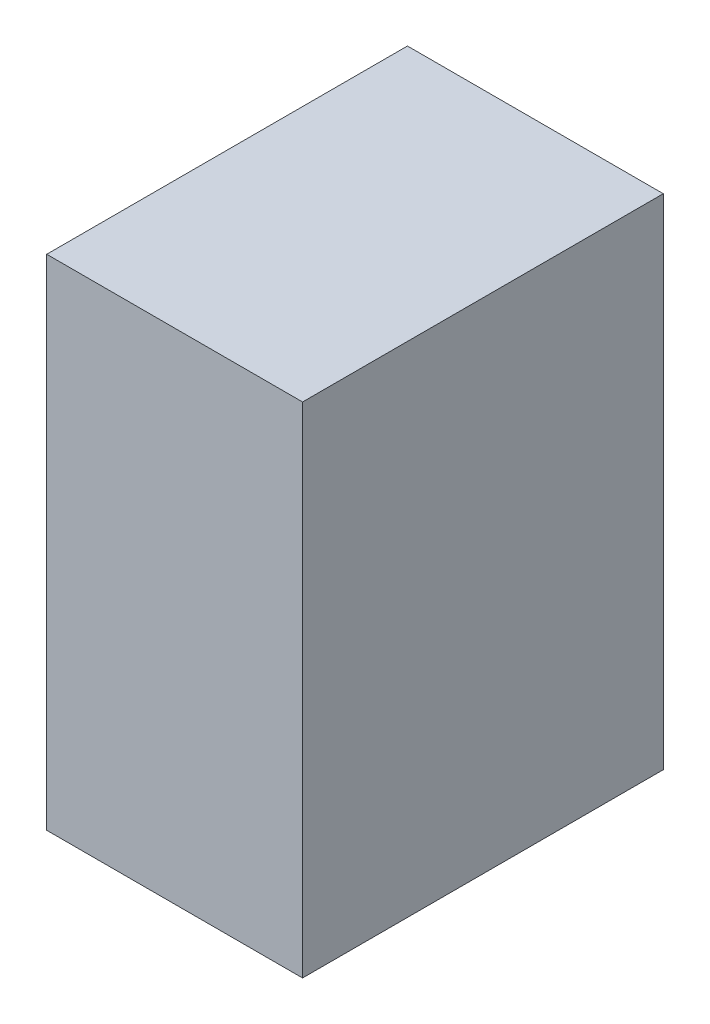
ISO-10303-21;
HEADER;
FILE_DESCRIPTION(('STEP AP214'),'2;1');
FILE_NAME('part.step','',(''),(''),'','','');
FILE_SCHEMA(('AUTOMOTIVE_DESIGN { 1 0 10303 214 1 1 1 1 }'));
ENDSEC;
DATA;
#1=APPLICATION_CONTEXT('core data for automotive mechanical design processes');
#2=APPLICATION_PROTOCOL_DEFINITION('international standard','automotive_design',2000,#1);
#3=PRODUCT_CONTEXT('',#1,'mechanical');
#4=PRODUCT('Part','Part','',(#3));
#5=PRODUCT_RELATED_PRODUCT_CATEGORY('part','',(#4));
#6=PRODUCT_DEFINITION_FORMATION('','',#4);
#7=PRODUCT_DEFINITION_CONTEXT('part definition',#1,'design');
#8=PRODUCT_DEFINITION('design','',#6,#7);
#9=PRODUCT_DEFINITION_SHAPE('','',#8);
#10=(LENGTH_UNIT() NAMED_UNIT(*) SI_UNIT(.MILLI.,.METRE.));
#11=(NAMED_UNIT(*) PLANE_ANGLE_UNIT() SI_UNIT($,.RADIAN.));
#12=(NAMED_UNIT(*) SI_UNIT($,.STERADIAN.) SOLID_ANGLE_UNIT());
#13=UNCERTAINTY_MEASURE_WITH_UNIT(LENGTH_MEASURE(1.E-05),#10,'distance_accuracy_value','');
#14=(GEOMETRIC_REPRESENTATION_CONTEXT(3) GLOBAL_UNCERTAINTY_ASSIGNED_CONTEXT((#13)) GLOBAL_UNIT_ASSIGNED_CONTEXT((#10,
#11,#12)) REPRESENTATION_CONTEXT('',''));
#15=CARTESIAN_POINT('',(0.,0.,0.));
#16=DIRECTION('',(0.,0.,1.));
#17=DIRECTION('',(1.,0.,0.));
#18=AXIS2_PLACEMENT_3D('',#15,#16,#17);
#19=CARTESIAN_POINT('',(25.4,0.,0.));
#20=DIRECTION('',(0.,0.,-1.));
#21=DIRECTION('',(-1.,0.,0.));
#22=AXIS2_PLACEMENT_3D('',#19,#20,#21);
#23=PLANE('',#22);
#24=DIRECTION('',(0.,-1.,0.));
#25=VECTOR('',#24,1.);
#26=CARTESIAN_POINT('',(0.,0.,0.));
#27=LINE('',#26,#25);
#28=CARTESIAN_POINT('',(0.,49.53,0.));
#29=VERTEX_POINT('',#28);
#30=CARTESIAN_POINT('',(0.,0.,0.));
#31=VERTEX_POINT('',#30);
#32=EDGE_CURVE('E101',#29,#31,#27,.T.);
#33=ORIENTED_EDGE('',*,*,#32,.T.);
#34=DIRECTION('',(-1.,0.,0.));
#35=VECTOR('',#34,1.);
#36=CARTESIAN_POINT('',(25.4,0.,0.));
#37=LINE('',#36,#35);
#38=CARTESIAN_POINT('',(25.4,0.,0.));
#39=VERTEX_POINT('',#38);
#40=EDGE_CURVE('E11',#39,#31,#37,.T.);
#41=ORIENTED_EDGE('',*,*,#40,.F.);
#42=DIRECTION('',(0.,-1.,0.));
#43=VECTOR('',#42,1.);
#44=CARTESIAN_POINT('',(25.4,0.,0.));
#45=LINE('',#44,#43);
#46=CARTESIAN_POINT('',(25.4,49.53,0.));
#47=VERTEX_POINT('',#46);
#48=EDGE_CURVE('E89',#47,#39,#45,.T.);
#49=ORIENTED_EDGE('',*,*,#48,.F.);
#50=DIRECTION('',(-1.,0.,0.));
#51=VECTOR('',#50,1.);
#52=CARTESIAN_POINT('',(25.4,49.53,0.));
#53=LINE('',#52,#51);
#54=EDGE_CURVE('E97',#47,#29,#53,.T.);
#55=ORIENTED_EDGE('',*,*,#54,.T.);
#56=EDGE_LOOP('',(#33,#41,#49,#55));
#57=FACE_BOUND('',#56,.T.);
#58=ADVANCED_FACE('F38',(#57),#23,.F.);
#59=CARTESIAN_POINT('',(25.4,0.,0.));
#60=DIRECTION('',(0.,1.,0.));
#61=DIRECTION('',(0.,0.,1.));
#62=AXIS2_PLACEMENT_3D('',#59,#60,#61);
#63=PLANE('',#62);
#64=DIRECTION('',(0.,0.,-1.));
#65=VECTOR('',#64,1.);
#66=CARTESIAN_POINT('',(0.,0.,0.));
#67=LINE('',#66,#65);
#68=CARTESIAN_POINT('',(0.,0.,-35.814));
#69=VERTEX_POINT('',#68);
#70=EDGE_CURVE('E93',#31,#69,#67,.T.);
#71=ORIENTED_EDGE('',*,*,#70,.T.);
#72=DIRECTION('',(-1.,0.,0.));
#73=VECTOR('',#72,1.);
#74=CARTESIAN_POINT('',(25.4,0.,-35.814));
#75=LINE('',#74,#73);
#76=CARTESIAN_POINT('',(25.4,0.,-35.814));
#77=VERTEX_POINT('',#76);
#78=EDGE_CURVE('E46',#77,#69,#75,.T.);
#79=ORIENTED_EDGE('',*,*,#78,.F.);
#80=DIRECTION('',(0.,0.,-1.));
#81=VECTOR('',#80,1.);
#82=CARTESIAN_POINT('',(25.4,0.,0.));
#83=LINE('',#82,#81);
#84=EDGE_CURVE('E84',#39,#77,#83,.T.);
#85=ORIENTED_EDGE('',*,*,#84,.F.);
#86=ORIENTED_EDGE('',*,*,#40,.T.);
#87=EDGE_LOOP('',(#71,#79,#85,#86));
#88=FACE_BOUND('',#87,.T.);
#89=ADVANCED_FACE('F92',(#88),#63,.F.);
#90=CARTESIAN_POINT('',(25.4,0.,-35.814));
#91=DIRECTION('',(0.,0.,1.));
#92=DIRECTION('',(1.,0.,0.));
#93=AXIS2_PLACEMENT_3D('',#90,#91,#92);
#94=PLANE('',#93);
#95=DIRECTION('',(0.,1.,0.));
#96=VECTOR('',#95,1.);
#97=CARTESIAN_POINT('',(0.,0.,-35.814));
#98=LINE('',#97,#96);
#99=CARTESIAN_POINT('',(0.,49.53,-35.814));
#100=VERTEX_POINT('',#99);
#101=EDGE_CURVE('E71',#69,#100,#98,.T.);
#102=ORIENTED_EDGE('',*,*,#101,.T.);
#103=DIRECTION('',(-1.,0.,0.));
#104=VECTOR('',#103,1.);
#105=CARTESIAN_POINT('',(25.4,49.53,-35.814));
#106=LINE('',#105,#104);
#107=CARTESIAN_POINT('',(25.4,49.53,-35.814));
#108=VERTEX_POINT('',#107);
#109=EDGE_CURVE('E94',#108,#100,#106,.T.);
#110=ORIENTED_EDGE('',*,*,#109,.F.);
#111=DIRECTION('',(0.,1.,0.));
#112=VECTOR('',#111,1.);
#113=CARTESIAN_POINT('',(25.4,0.,-35.814));
#114=LINE('',#113,#112);
#115=EDGE_CURVE('E87',#77,#108,#114,.T.);
#116=ORIENTED_EDGE('',*,*,#115,.F.);
#117=ORIENTED_EDGE('',*,*,#78,.T.);
#118=EDGE_LOOP('',(#102,#110,#116,#117));
#119=FACE_BOUND('',#118,.T.);
#120=ADVANCED_FACE('F95',(#119),#94,.F.);
#121=CARTESIAN_POINT('',(25.4,49.53,0.));
#122=DIRECTION('',(0.,-1.,0.));
#123=DIRECTION('',(0.,0.,-1.));
#124=AXIS2_PLACEMENT_3D('',#121,#122,#123);
#125=PLANE('',#124);
#126=DIRECTION('',(0.,0.,1.));
#127=VECTOR('',#126,1.);
#128=CARTESIAN_POINT('',(0.,49.53,0.));
#129=LINE('',#128,#127);
#130=EDGE_CURVE('E77',#100,#29,#129,.T.);
#131=ORIENTED_EDGE('',*,*,#130,.T.);
#132=ORIENTED_EDGE('',*,*,#54,.F.);
#133=DIRECTION('',(0.,0.,1.));
#134=VECTOR('',#133,1.);
#135=CARTESIAN_POINT('',(25.4,49.53,0.));
#136=LINE('',#135,#134);
#137=EDGE_CURVE('E54',#108,#47,#136,.T.);
#138=ORIENTED_EDGE('',*,*,#137,.F.);
#139=ORIENTED_EDGE('',*,*,#109,.T.);
#140=EDGE_LOOP('',(#131,#132,#138,#139));
#141=FACE_BOUND('',#140,.T.);
#142=ADVANCED_FACE('F108',(#141),#125,.F.);
#143=CARTESIAN_POINT('',(25.4,49.53,0.));
#144=DIRECTION('',(-1.,0.,0.));
#145=DIRECTION('',(0.,0.,1.));
#146=AXIS2_PLACEMENT_3D('',#143,#144,#145);
#147=PLANE('',#146);
#148=ORIENTED_EDGE('',*,*,#48,.T.);
#149=ORIENTED_EDGE('',*,*,#84,.T.);
#150=ORIENTED_EDGE('',*,*,#115,.T.);
#151=ORIENTED_EDGE('',*,*,#137,.T.);
#152=EDGE_LOOP('',(#148,#149,#150,#151));
#153=FACE_BOUND('',#152,.T.);
#154=ADVANCED_FACE('F85',(#153),#147,.F.);
#155=CARTESIAN_POINT('',(0.,49.53,0.));
#156=DIRECTION('',(-1.,0.,0.));
#157=DIRECTION('',(0.,0.,1.));
#158=AXIS2_PLACEMENT_3D('',#155,#156,#157);
#159=PLANE('',#158);
#160=ORIENTED_EDGE('',*,*,#32,.F.);
#161=ORIENTED_EDGE('',*,*,#130,.F.);
#162=ORIENTED_EDGE('',*,*,#101,.F.);
#163=ORIENTED_EDGE('',*,*,#70,.F.);
#164=EDGE_LOOP('',(#160,#161,#162,#163));
#165=FACE_BOUND('',#164,.T.);
#166=ADVANCED_FACE('F111',(#165),#159,.T.);
#167=CLOSED_SHELL('',(#58,#89,#120,#142,#154,#166));
#168=MANIFOLD_SOLID_BREP('B2',#167);
#169=ADVANCED_BREP_SHAPE_REPRESENTATION('',(#18,#168),#14);
#170=SHAPE_DEFINITION_REPRESENTATION(#9,#169);
ENDSEC;
END-ISO-10303-21;
